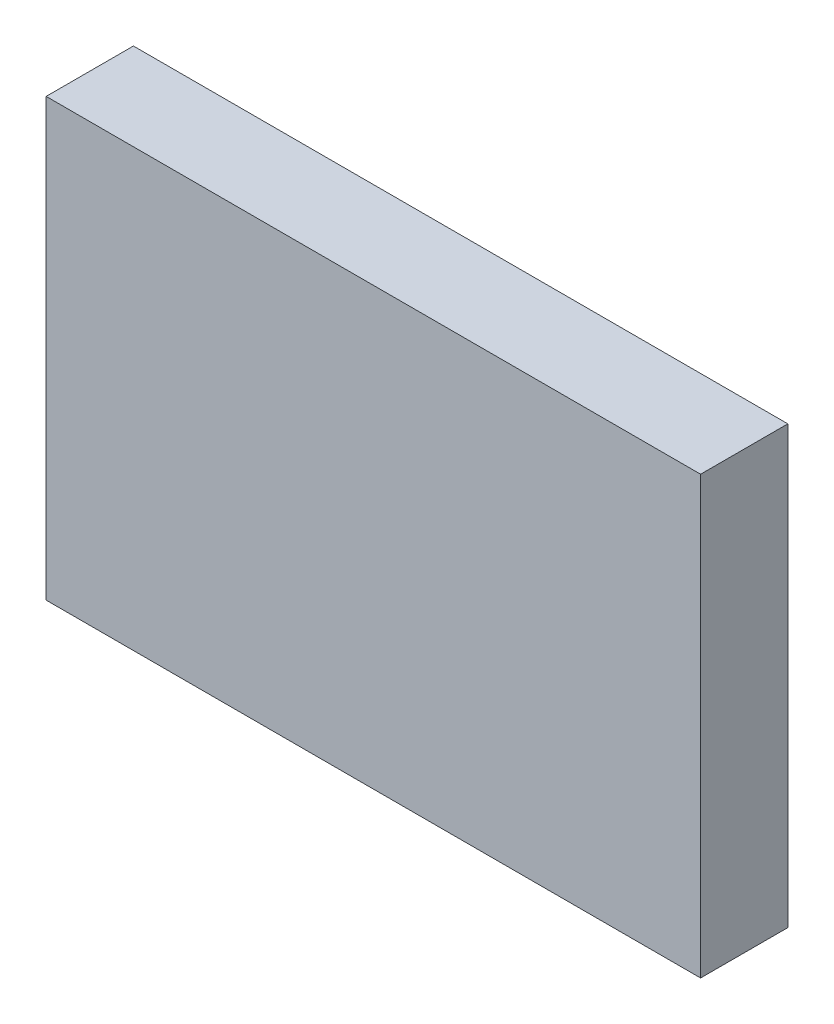
ISO-10303-21;
HEADER;
FILE_DESCRIPTION(('STEP AP214'),'2;1');
FILE_NAME('part.step','',(''),(''),'','','');
FILE_SCHEMA(('AUTOMOTIVE_DESIGN { 1 0 10303 214 1 1 1 1 }'));
ENDSEC;
DATA;
#1=APPLICATION_CONTEXT('core data for automotive mechanical design processes');
#2=APPLICATION_PROTOCOL_DEFINITION('international standard','automotive_design',2000,#1);
#3=PRODUCT_CONTEXT('',#1,'mechanical');
#4=PRODUCT('Part','Part','',(#3));
#5=PRODUCT_RELATED_PRODUCT_CATEGORY('part','',(#4));
#6=PRODUCT_DEFINITION_FORMATION('','',#4);
#7=PRODUCT_DEFINITION_CONTEXT('part definition',#1,'design');
#8=PRODUCT_DEFINITION('design','',#6,#7);
#9=PRODUCT_DEFINITION_SHAPE('','',#8);
#10=(LENGTH_UNIT() NAMED_UNIT(*) SI_UNIT(.MILLI.,.METRE.));
#11=(NAMED_UNIT(*) PLANE_ANGLE_UNIT() SI_UNIT($,.RADIAN.));
#12=(NAMED_UNIT(*) SI_UNIT($,.STERADIAN.) SOLID_ANGLE_UNIT());
#13=UNCERTAINTY_MEASURE_WITH_UNIT(LENGTH_MEASURE(1.E-05),#10,'distance_accuracy_value','');
#14=(GEOMETRIC_REPRESENTATION_CONTEXT(3) GLOBAL_UNCERTAINTY_ASSIGNED_CONTEXT((#13)) GLOBAL_UNIT_ASSIGNED_CONTEXT((#10,
#11,#12)) REPRESENTATION_CONTEXT('',''));
#15=CARTESIAN_POINT('',(0.,0.,0.));
#16=DIRECTION('',(0.,0.,1.));
#17=DIRECTION('',(1.,0.,0.));
#18=AXIS2_PLACEMENT_3D('',#15,#16,#17);
#19=CARTESIAN_POINT('',(30.,-20.,8.));
#20=DIRECTION('',(-1.,0.,0.));
#21=DIRECTION('',(0.,0.,1.));
#22=AXIS2_PLACEMENT_3D('',#19,#20,#21);
#23=PLANE('',#22);
#24=DIRECTION('',(0.,1.,0.));
#25=VECTOR('',#24,1.);
#26=CARTESIAN_POINT('',(30.,-20.,0.));
#27=LINE('',#26,#25);
#28=CARTESIAN_POINT('',(30.,-20.,0.));
#29=VERTEX_POINT('',#28);
#30=CARTESIAN_POINT('',(30.,20.,0.));
#31=VERTEX_POINT('',#30);
#32=EDGE_CURVE('E113',#29,#31,#27,.T.);
#33=ORIENTED_EDGE('',*,*,#32,.T.);
#34=DIRECTION('',(0.,0.,-1.));
#35=VECTOR('',#34,1.);
#36=CARTESIAN_POINT('',(30.,20.,8.));
#37=LINE('',#36,#35);
#38=CARTESIAN_POINT('',(30.,20.,8.));
#39=VERTEX_POINT('',#38);
#40=EDGE_CURVE('E11',#39,#31,#37,.T.);
#41=ORIENTED_EDGE('',*,*,#40,.F.);
#42=DIRECTION('',(0.,1.,0.));
#43=VECTOR('',#42,1.);
#44=CARTESIAN_POINT('',(30.,-20.,8.));
#45=LINE('',#44,#43);
#46=CARTESIAN_POINT('',(30.,-20.,8.));
#47=VERTEX_POINT('',#46);
#48=EDGE_CURVE('E97',#47,#39,#45,.T.);
#49=ORIENTED_EDGE('',*,*,#48,.F.);
#50=DIRECTION('',(0.,0.,-1.));
#51=VECTOR('',#50,1.);
#52=CARTESIAN_POINT('',(30.,-20.,8.));
#53=LINE('',#52,#51);
#54=EDGE_CURVE('E109',#47,#29,#53,.T.);
#55=ORIENTED_EDGE('',*,*,#54,.T.);
#56=EDGE_LOOP('',(#33,#41,#49,#55));
#57=FACE_BOUND('',#56,.T.);
#58=ADVANCED_FACE('F45',(#57),#23,.F.);
#59=CARTESIAN_POINT('',(-30.,20.,8.));
#60=DIRECTION('',(0.,-1.,0.));
#61=DIRECTION('',(0.,0.,-1.));
#62=AXIS2_PLACEMENT_3D('',#59,#60,#61);
#63=PLANE('',#62);
#64=DIRECTION('',(-1.,0.,0.));
#65=VECTOR('',#64,1.);
#66=CARTESIAN_POINT('',(-30.,20.,0.));
#67=LINE('',#66,#65);
#68=CARTESIAN_POINT('',(-30.,20.,0.));
#69=VERTEX_POINT('',#68);
#70=EDGE_CURVE('E102',#31,#69,#67,.T.);
#71=ORIENTED_EDGE('',*,*,#70,.T.);
#72=DIRECTION('',(0.,0.,-1.));
#73=VECTOR('',#72,1.);
#74=CARTESIAN_POINT('',(-30.,20.,8.));
#75=LINE('',#74,#73);
#76=CARTESIAN_POINT('',(-30.,20.,8.));
#77=VERTEX_POINT('',#76);
#78=EDGE_CURVE('E54',#77,#69,#75,.T.);
#79=ORIENTED_EDGE('',*,*,#78,.F.);
#80=DIRECTION('',(-1.,0.,0.));
#81=VECTOR('',#80,1.);
#82=CARTESIAN_POINT('',(-30.,20.,8.));
#83=LINE('',#82,#81);
#84=EDGE_CURVE('E92',#39,#77,#83,.T.);
#85=ORIENTED_EDGE('',*,*,#84,.F.);
#86=ORIENTED_EDGE('',*,*,#40,.T.);
#87=EDGE_LOOP('',(#71,#79,#85,#86));
#88=FACE_BOUND('',#87,.T.);
#89=ADVANCED_FACE('F101',(#88),#63,.F.);
#90=CARTESIAN_POINT('',(-30.,-20.,8.));
#91=DIRECTION('',(1.,0.,0.));
#92=DIRECTION('',(0.,0.,-1.));
#93=AXIS2_PLACEMENT_3D('',#90,#91,#92);
#94=PLANE('',#93);
#95=DIRECTION('',(0.,-1.,0.));
#96=VECTOR('',#95,1.);
#97=CARTESIAN_POINT('',(-30.,-20.,0.));
#98=LINE('',#97,#96);
#99=CARTESIAN_POINT('',(-30.,-20.,0.));
#100=VERTEX_POINT('',#99);
#101=EDGE_CURVE('E79',#69,#100,#98,.T.);
#102=ORIENTED_EDGE('',*,*,#101,.T.);
#103=DIRECTION('',(0.,0.,-1.));
#104=VECTOR('',#103,1.);
#105=CARTESIAN_POINT('',(-30.,-20.,8.));
#106=LINE('',#105,#104);
#107=CARTESIAN_POINT('',(-30.,-20.,8.));
#108=VERTEX_POINT('',#107);
#109=EDGE_CURVE('E104',#108,#100,#106,.T.);
#110=ORIENTED_EDGE('',*,*,#109,.F.);
#111=DIRECTION('',(0.,-1.,0.));
#112=VECTOR('',#111,1.);
#113=CARTESIAN_POINT('',(-30.,-20.,8.));
#114=LINE('',#113,#112);
#115=EDGE_CURVE('E95',#77,#108,#114,.T.);
#116=ORIENTED_EDGE('',*,*,#115,.F.);
#117=ORIENTED_EDGE('',*,*,#78,.T.);
#118=EDGE_LOOP('',(#102,#110,#116,#117));
#119=FACE_BOUND('',#118,.T.);
#120=ADVANCED_FACE('F105',(#119),#94,.F.);
#121=CARTESIAN_POINT('',(-30.,-20.,8.));
#122=DIRECTION('',(0.,1.,0.));
#123=DIRECTION('',(0.,0.,1.));
#124=AXIS2_PLACEMENT_3D('',#121,#122,#123);
#125=PLANE('',#124);
#126=DIRECTION('',(1.,0.,0.));
#127=VECTOR('',#126,1.);
#128=CARTESIAN_POINT('',(-30.,-20.,0.));
#129=LINE('',#128,#127);
#130=EDGE_CURVE('E85',#100,#29,#129,.T.);
#131=ORIENTED_EDGE('',*,*,#130,.T.);
#132=ORIENTED_EDGE('',*,*,#54,.F.);
#133=DIRECTION('',(1.,0.,0.));
#134=VECTOR('',#133,1.);
#135=CARTESIAN_POINT('',(-30.,-20.,8.));
#136=LINE('',#135,#134);
#137=EDGE_CURVE('E62',#108,#47,#136,.T.);
#138=ORIENTED_EDGE('',*,*,#137,.F.);
#139=ORIENTED_EDGE('',*,*,#109,.T.);
#140=EDGE_LOOP('',(#131,#132,#138,#139));
#141=FACE_BOUND('',#140,.T.);
#142=ADVANCED_FACE('F126',(#141),#125,.F.);
#143=CARTESIAN_POINT('',(0.,0.,8.));
#144=DIRECTION('',(0.,0.,-1.));
#145=DIRECTION('',(-1.,0.,0.));
#146=AXIS2_PLACEMENT_3D('',#143,#144,#145);
#147=PLANE('',#146);
#148=ORIENTED_EDGE('',*,*,#48,.T.);
#149=ORIENTED_EDGE('',*,*,#84,.T.);
#150=ORIENTED_EDGE('',*,*,#115,.T.);
#151=ORIENTED_EDGE('',*,*,#137,.T.);
#152=EDGE_LOOP('',(#148,#149,#150,#151));
#153=FACE_BOUND('',#152,.T.);
#154=ADVANCED_FACE('F93',(#153),#147,.F.);
#155=CARTESIAN_POINT('',(0.,0.,0.));
#156=DIRECTION('',(0.,0.,-1.));
#157=DIRECTION('',(-1.,0.,0.));
#158=AXIS2_PLACEMENT_3D('',#155,#156,#157);
#159=PLANE('',#158);
#160=ORIENTED_EDGE('',*,*,#32,.F.);
#161=ORIENTED_EDGE('',*,*,#130,.F.);
#162=ORIENTED_EDGE('',*,*,#101,.F.);
#163=ORIENTED_EDGE('',*,*,#70,.F.);
#164=EDGE_LOOP('',(#160,#161,#162,#163));
#165=FACE_BOUND('',#164,.T.);
#166=ADVANCED_FACE('F129',(#165),#159,.T.);
#167=CLOSED_SHELL('',(#58,#89,#120,#142,#154,#166));
#168=MANIFOLD_SOLID_BREP('B2',#167);
#169=ADVANCED_BREP_SHAPE_REPRESENTATION('',(#18,#168),#14);
#170=SHAPE_DEFINITION_REPRESENTATION(#9,#169);
ENDSEC;
END-ISO-10303-21;
